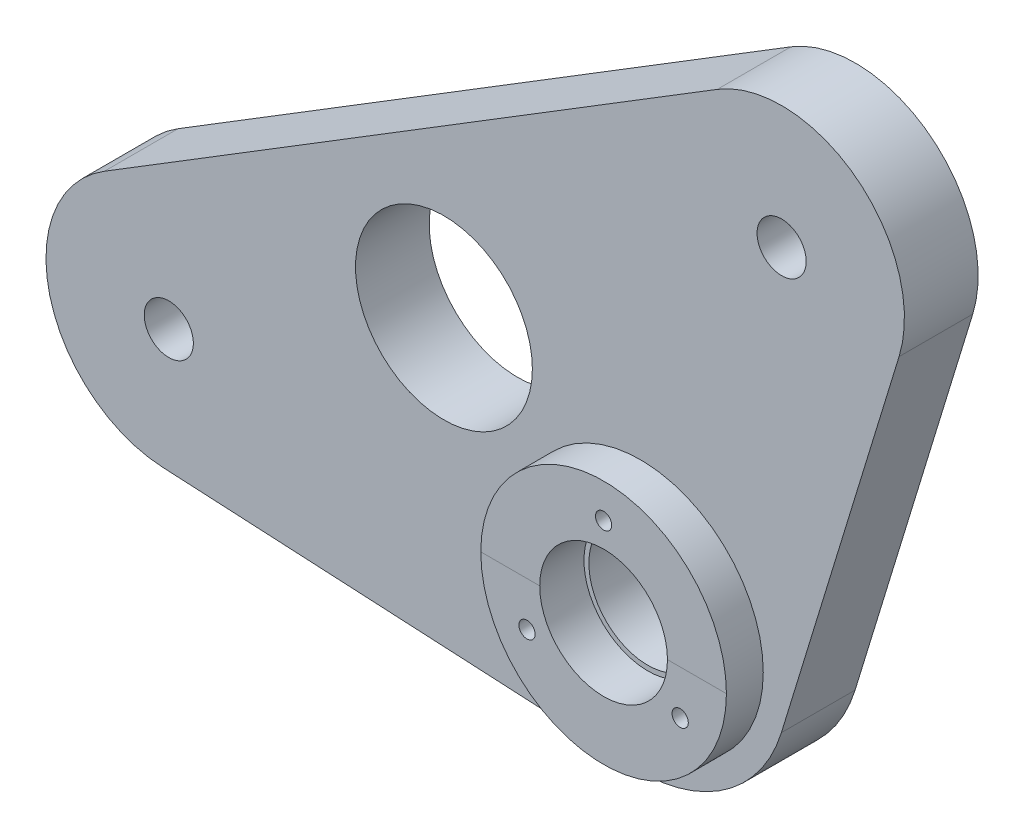
ISO-10303-21;
HEADER;
FILE_DESCRIPTION(('STEP AP214'),'2;1');
FILE_NAME('part.step','',(''),(''),'','','');
FILE_SCHEMA(('AUTOMOTIVE_DESIGN { 1 0 10303 214 1 1 1 1 }'));
ENDSEC;
DATA;
#1=APPLICATION_CONTEXT('core data for automotive mechanical design processes');
#2=APPLICATION_PROTOCOL_DEFINITION('international standard','automotive_design',2000,#1);
#3=PRODUCT_CONTEXT('',#1,'mechanical');
#4=PRODUCT('Part','Part','',(#3));
#5=PRODUCT_RELATED_PRODUCT_CATEGORY('part','',(#4));
#6=PRODUCT_DEFINITION_FORMATION('','',#4);
#7=PRODUCT_DEFINITION_CONTEXT('part definition',#1,'design');
#8=PRODUCT_DEFINITION('design','',#6,#7);
#9=PRODUCT_DEFINITION_SHAPE('','',#8);
#10=(LENGTH_UNIT() NAMED_UNIT(*) SI_UNIT(.MILLI.,.METRE.));
#11=(NAMED_UNIT(*) PLANE_ANGLE_UNIT() SI_UNIT($,.RADIAN.));
#12=(NAMED_UNIT(*) SI_UNIT($,.STERADIAN.) SOLID_ANGLE_UNIT());
#13=UNCERTAINTY_MEASURE_WITH_UNIT(LENGTH_MEASURE(1.E-05),#10,'distance_accuracy_value','');
#14=(GEOMETRIC_REPRESENTATION_CONTEXT(3) GLOBAL_UNCERTAINTY_ASSIGNED_CONTEXT((#13)) GLOBAL_UNIT_ASSIGNED_CONTEXT((#10,
#11,#12)) REPRESENTATION_CONTEXT('',''));
#15=CARTESIAN_POINT('',(0.,0.,0.));
#16=DIRECTION('',(0.,0.,1.));
#17=DIRECTION('',(1.,0.,0.));
#18=AXIS2_PLACEMENT_3D('',#15,#16,#17);
#19=CARTESIAN_POINT('',(0.,0.,15.));
#20=DIRECTION('',(0.,0.,1.));
#21=DIRECTION('',(1.,0.,0.));
#22=AXIS2_PLACEMENT_3D('',#19,#20,#21);
#23=PLANE('',#22);
#24=CARTESIAN_POINT('',(-15.5884572681198,-9.00000000000008,15.));
#25=DIRECTION('',(0.,0.,1.));
#26=DIRECTION('',(1.,0.,0.));
#27=AXIS2_PLACEMENT_3D('',#24,#25,#26);
#28=CIRCLE('',#27,1.64999999999999);
#29=CARTESIAN_POINT('',(-13.9384572681199,-9.00000000000008,15.));
#30=VERTEX_POINT('',#29);
#31=EDGE_CURVE('E168',#30,#30,#28,.T.);
#32=ORIENTED_EDGE('',*,*,#31,.F.);
#33=EDGE_LOOP('',(#32));
#34=FACE_BOUND('',#33,.T.);
#35=CARTESIAN_POINT('',(15.5884572681199,-9.00000000000007,15.));
#36=DIRECTION('',(0.,0.,1.));
#37=DIRECTION('',(1.,0.,0.));
#38=AXIS2_PLACEMENT_3D('',#35,#36,#37);
#39=CIRCLE('',#38,1.64999999999999);
#40=CARTESIAN_POINT('',(17.2384572681198,-9.00000000000007,15.));
#41=VERTEX_POINT('',#40);
#42=EDGE_CURVE('E162',#41,#41,#39,.T.);
#43=ORIENTED_EDGE('',*,*,#42,.F.);
#44=EDGE_LOOP('',(#43));
#45=FACE_BOUND('',#44,.T.);
#46=CARTESIAN_POINT('',(0.,0.,15.));
#47=DIRECTION('',(0.,0.,1.));
#48=DIRECTION('',(1.,0.,0.));
#49=AXIS2_PLACEMENT_3D('',#46,#47,#48);
#50=CIRCLE('',#49,13.);
#51=CARTESIAN_POINT('',(-13.,0.,15.));
#52=VERTEX_POINT('',#51);
#53=CARTESIAN_POINT('',(13.,0.,15.));
#54=VERTEX_POINT('',#53);
#55=EDGE_CURVE('E188',#52,#54,#50,.T.);
#56=ORIENTED_EDGE('',*,*,#55,.F.);
#57=DIRECTION('',(-1.,0.,0.));
#58=VECTOR('',#57,1.);
#59=CARTESIAN_POINT('',(0.,0.,15.));
#60=LINE('',#59,#58);
#61=CARTESIAN_POINT('',(-25.,0.,15.));
#62=VERTEX_POINT('',#61);
#63=EDGE_CURVE('E12',#52,#62,#60,.T.);
#64=ORIENTED_EDGE('',*,*,#63,.T.);
#65=CARTESIAN_POINT('',(0.,0.,15.));
#66=DIRECTION('',(0.,0.,1.));
#67=DIRECTION('',(1.,0.,0.));
#68=AXIS2_PLACEMENT_3D('',#65,#66,#67);
#69=CIRCLE('',#68,25.);
#70=CARTESIAN_POINT('',(25.,0.,15.));
#71=VERTEX_POINT('',#70);
#72=EDGE_CURVE('E192',#62,#71,#69,.T.);
#73=ORIENTED_EDGE('',*,*,#72,.T.);
#74=DIRECTION('',(-1.,0.,0.));
#75=VECTOR('',#74,1.);
#76=CARTESIAN_POINT('',(0.,0.,15.));
#77=LINE('',#76,#75);
#78=EDGE_CURVE('E57',#71,#54,#77,.T.);
#79=ORIENTED_EDGE('',*,*,#78,.T.);
#80=EDGE_LOOP('',(#56,#64,#73,#79));
#81=FACE_BOUND('',#80,.T.);
#82=ADVANCED_FACE('F48',(#34,#45,#81),#23,.T.);
#83=CARTESIAN_POINT('',(0.,0.,-15.));
#84=DIRECTION('',(0.,0.,1.));
#85=DIRECTION('',(1.,0.,0.));
#86=AXIS2_PLACEMENT_3D('',#83,#84,#85);
#87=CYLINDRICAL_SURFACE('',#86,12.);
#88=CARTESIAN_POINT('',(0.,0.,6.));
#89=DIRECTION('',(0.,0.,1.));
#90=DIRECTION('',(1.,0.,0.));
#91=AXIS2_PLACEMENT_3D('',#88,#89,#90);
#92=CIRCLE('',#91,12.);
#93=CARTESIAN_POINT('',(12.,0.,6.));
#94=VERTEX_POINT('',#93);
#95=EDGE_CURVE('E184',#94,#94,#92,.F.);
#96=ORIENTED_EDGE('',*,*,#95,.F.);
#97=EDGE_LOOP('',(#96));
#98=FACE_BOUND('',#97,.T.);
#99=CARTESIAN_POINT('',(0.,0.,-6.));
#100=DIRECTION('',(0.,0.,-1.));
#101=DIRECTION('',(-1.,0.,0.));
#102=AXIS2_PLACEMENT_3D('',#99,#100,#101);
#103=CIRCLE('',#102,12.);
#104=CARTESIAN_POINT('',(-12.,0.,-6.));
#105=VERTEX_POINT('',#104);
#106=EDGE_CURVE('E178',#105,#105,#103,.F.);
#107=ORIENTED_EDGE('',*,*,#106,.F.);
#108=EDGE_LOOP('',(#107));
#109=FACE_BOUND('',#108,.T.);
#110=ADVANCED_FACE('F285',(#98,#109),#87,.F.);
#111=CARTESIAN_POINT('',(-96.,0.,7.5));
#112=DIRECTION('',(0.,0.,-1.));
#113=DIRECTION('',(-1.,0.,0.));
#114=AXIS2_PLACEMENT_3D('',#111,#112,#113);
#115=CYLINDRICAL_SURFACE('',#114,25.);
#116=CARTESIAN_POINT('',(-96.,0.,-7.5));
#117=DIRECTION('',(0.,0.,1.));
#118=DIRECTION('',(1.,0.,0.));
#119=AXIS2_PLACEMENT_3D('',#116,#117,#118);
#120=CIRCLE('',#119,25.);
#121=CARTESIAN_POINT('',(-109.107307638029,21.2884589973548,-7.5));
#122=VERTEX_POINT('',#121);
#123=CARTESIAN_POINT('',(-97.3020833333333,-24.9660685529992,-7.5));
#124=VERTEX_POINT('',#123);
#125=EDGE_CURVE('E202',#122,#124,#120,.T.);
#126=ORIENTED_EDGE('',*,*,#125,.T.);
#127=DIRECTION('',(0.,0.,-1.));
#128=VECTOR('',#127,1.);
#129=CARTESIAN_POINT('',(-97.3020833333333,-24.9660685529992,7.5));
#130=LINE('',#129,#128);
#131=CARTESIAN_POINT('',(-97.3020833333333,-24.9660685529992,7.5));
#132=VERTEX_POINT('',#131);
#133=EDGE_CURVE('E251',#132,#124,#130,.T.);
#134=ORIENTED_EDGE('',*,*,#133,.F.);
#135=CARTESIAN_POINT('',(-96.,0.,7.5));
#136=DIRECTION('',(0.,0.,1.));
#137=DIRECTION('',(1.,0.,0.));
#138=AXIS2_PLACEMENT_3D('',#135,#136,#137);
#139=CIRCLE('',#138,25.);
#140=CARTESIAN_POINT('',(-109.107307638029,21.2884589973548,7.5));
#141=VERTEX_POINT('',#140);
#142=EDGE_CURVE('E211',#141,#132,#139,.T.);
#143=ORIENTED_EDGE('',*,*,#142,.F.);
#144=DIRECTION('',(0.,0.,-1.));
#145=VECTOR('',#144,1.);
#146=CARTESIAN_POINT('',(-109.107307638029,21.2884589973548,7.5));
#147=LINE('',#146,#145);
#148=EDGE_CURVE('E225',#141,#122,#147,.T.);
#149=ORIENTED_EDGE('',*,*,#148,.T.);
#150=EDGE_LOOP('',(#126,#134,#143,#149));
#151=FACE_BOUND('',#150,.T.);
#152=ADVANCED_FACE('F50',(#151),#115,.T.);
#153=CARTESIAN_POINT('',(-97.3020833333333,-24.9660685529992,7.5));
#154=DIRECTION('',(0.0520833333333332,0.998642742119968,0.));
#155=DIRECTION('',(-0.998642742119968,0.0520833333333332,0.));
#156=AXIS2_PLACEMENT_3D('',#153,#154,#155);
#157=PLANE('',#156);
#158=DIRECTION('',(0.998642742119968,-0.0520833333333332,0.));
#159=VECTOR('',#158,1.);
#160=CARTESIAN_POINT('',(-97.3020833333333,-24.9660685529992,-7.5));
#161=LINE('',#160,#159);
#162=CARTESIAN_POINT('',(-1.5625,-29.959282263599,-7.5));
#163=VERTEX_POINT('',#162);
#164=EDGE_CURVE('E228',#124,#163,#161,.T.);
#165=ORIENTED_EDGE('',*,*,#164,.T.);
#166=DIRECTION('',(0.,0.,-1.));
#167=VECTOR('',#166,1.);
#168=CARTESIAN_POINT('',(-1.5625,-29.959282263599,7.5));
#169=LINE('',#168,#167);
#170=CARTESIAN_POINT('',(-1.5625,-29.959282263599,7.5));
#171=VERTEX_POINT('',#170);
#172=EDGE_CURVE('E248',#171,#163,#169,.T.);
#173=ORIENTED_EDGE('',*,*,#172,.F.);
#174=DIRECTION('',(0.998642742119968,-0.0520833333333332,0.));
#175=VECTOR('',#174,1.);
#176=CARTESIAN_POINT('',(-97.3020833333333,-24.9660685529992,7.5));
#177=LINE('',#176,#175);
#178=EDGE_CURVE('E214',#132,#171,#177,.T.);
#179=ORIENTED_EDGE('',*,*,#178,.F.);
#180=ORIENTED_EDGE('',*,*,#133,.T.);
#181=EDGE_LOOP('',(#165,#173,#179,#180));
#182=FACE_BOUND('',#181,.T.);
#183=ADVANCED_FACE('F341',(#182),#157,.F.);
#184=CARTESIAN_POINT('',(0.,0.,7.5));
#185=DIRECTION('',(0.,0.,-1.));
#186=DIRECTION('',(-1.,0.,0.));
#187=AXIS2_PLACEMENT_3D('',#184,#185,#186);
#188=CYLINDRICAL_SURFACE('',#187,30.);
#189=CARTESIAN_POINT('',(0.,0.,-7.5));
#190=DIRECTION('',(0.,0.,1.));
#191=DIRECTION('',(1.,0.,0.));
#192=AXIS2_PLACEMENT_3D('',#189,#190,#191);
#193=CIRCLE('',#192,30.);
#194=CARTESIAN_POINT('',(28.6863265068597,-8.78035714204369,-7.5));
#195=VERTEX_POINT('',#194);
#196=EDGE_CURVE('E230',#163,#195,#193,.T.);
#197=ORIENTED_EDGE('',*,*,#196,.T.);
#198=DIRECTION('',(0.,0.,-1.));
#199=VECTOR('',#198,1.);
#200=CARTESIAN_POINT('',(28.6863265068597,-8.78035714204369,7.5));
#201=LINE('',#200,#199);
#202=CARTESIAN_POINT('',(28.6863265068597,-8.78035714204369,7.5));
#203=VERTEX_POINT('',#202);
#204=EDGE_CURVE('E245',#203,#195,#201,.T.);
#205=ORIENTED_EDGE('',*,*,#204,.F.);
#206=CARTESIAN_POINT('',(0.,0.,7.5));
#207=DIRECTION('',(0.,0.,1.));
#208=DIRECTION('',(1.,0.,0.));
#209=AXIS2_PLACEMENT_3D('',#206,#207,#208);
#210=CIRCLE('',#209,30.);
#211=EDGE_CURVE('E217',#171,#203,#210,.T.);
#212=ORIENTED_EDGE('',*,*,#211,.F.);
#213=ORIENTED_EDGE('',*,*,#172,.T.);
#214=EDGE_LOOP('',(#197,#205,#212,#213));
#215=FACE_BOUND('',#214,.T.);
#216=ADVANCED_FACE('F338',(#215),#188,.T.);
#217=CARTESIAN_POINT('',(28.6863265068597,-8.78035714204369,7.5));
#218=DIRECTION('',(-0.956210883561991,0.292678571401456,0.));
#219=DIRECTION('',(-0.292678571401456,-0.956210883561991,0.));
#220=AXIS2_PLACEMENT_3D('',#217,#218,#219);
#221=PLANE('',#220);
#222=DIRECTION('',(0.292678571401456,0.956210883561991,0.));
#223=VECTOR('',#222,1.);
#224=CARTESIAN_POINT('',(28.6863265068597,-8.78035714204369,-7.5));
#225=LINE('',#224,#223);
#226=CARTESIAN_POINT('',(52.6413121781087,69.4830357149636,-7.5));
#227=VERTEX_POINT('',#226);
#228=EDGE_CURVE('E232',#195,#227,#225,.T.);
#229=ORIENTED_EDGE('',*,*,#228,.T.);
#230=DIRECTION('',(0.,0.,-1.));
#231=VECTOR('',#230,1.);
#232=CARTESIAN_POINT('',(52.6413121781087,69.4830357149636,7.5));
#233=LINE('',#232,#231);
#234=CARTESIAN_POINT('',(52.6413121781087,69.4830357149636,7.5));
#235=VERTEX_POINT('',#234);
#236=EDGE_CURVE('E242',#235,#227,#233,.T.);
#237=ORIENTED_EDGE('',*,*,#236,.F.);
#238=DIRECTION('',(0.292678571401456,0.956210883561991,0.));
#239=VECTOR('',#238,1.);
#240=CARTESIAN_POINT('',(28.6863265068597,-8.78035714204369,7.5));
#241=LINE('',#240,#239);
#242=EDGE_CURVE('E219',#203,#235,#241,.T.);
#243=ORIENTED_EDGE('',*,*,#242,.F.);
#244=ORIENTED_EDGE('',*,*,#204,.T.);
#245=EDGE_LOOP('',(#229,#237,#243,#244));
#246=FACE_BOUND('',#245,.T.);
#247=ADVANCED_FACE('F334',(#246),#221,.F.);
#248=CARTESIAN_POINT('',(28.7360400890589,76.8,7.5));
#249=DIRECTION('',(0.,0.,-1.));
#250=DIRECTION('',(-1.,0.,0.));
#251=AXIS2_PLACEMENT_3D('',#248,#249,#250);
#252=CYLINDRICAL_SURFACE('',#251,25.);
#253=CARTESIAN_POINT('',(28.7360400890589,76.8,-7.5));
#254=DIRECTION('',(0.,0.,1.));
#255=DIRECTION('',(1.,0.,0.));
#256=AXIS2_PLACEMENT_3D('',#253,#254,#255);
#257=CIRCLE('',#256,25.);
#258=CARTESIAN_POINT('',(15.6287324510297,98.0884589973549,-7.5));
#259=VERTEX_POINT('',#258);
#260=EDGE_CURVE('E234',#227,#259,#257,.T.);
#261=ORIENTED_EDGE('',*,*,#260,.T.);
#262=DIRECTION('',(0.,0.,-1.));
#263=VECTOR('',#262,1.);
#264=CARTESIAN_POINT('',(15.6287324510297,98.0884589973549,7.5));
#265=LINE('',#264,#263);
#266=CARTESIAN_POINT('',(15.6287324510297,98.0884589973549,7.5));
#267=VERTEX_POINT('',#266);
#268=EDGE_CURVE('E239',#267,#259,#265,.T.);
#269=ORIENTED_EDGE('',*,*,#268,.F.);
#270=CARTESIAN_POINT('',(28.7360400890589,76.8,7.5));
#271=DIRECTION('',(0.,0.,1.));
#272=DIRECTION('',(1.,0.,0.));
#273=AXIS2_PLACEMENT_3D('',#270,#271,#272);
#274=CIRCLE('',#273,25.);
#275=EDGE_CURVE('E221',#235,#267,#274,.T.);
#276=ORIENTED_EDGE('',*,*,#275,.F.);
#277=ORIENTED_EDGE('',*,*,#236,.T.);
#278=EDGE_LOOP('',(#261,#269,#276,#277));
#279=FACE_BOUND('',#278,.T.);
#280=ADVANCED_FACE('F330',(#279),#252,.T.);
#281=CARTESIAN_POINT('',(-109.107307638029,21.2884589973548,7.5));
#282=DIRECTION('',(0.524292305521172,-0.851538359894194,0.));
#283=DIRECTION('',(0.851538359894194,0.524292305521172,0.));
#284=AXIS2_PLACEMENT_3D('',#281,#282,#283);
#285=PLANE('',#284);
#286=DIRECTION('',(-0.851538359894194,-0.524292305521172,0.));
#287=VECTOR('',#286,1.);
#288=CARTESIAN_POINT('',(-109.107307638029,21.2884589973548,-7.5));
#289=LINE('',#288,#287);
#290=EDGE_CURVE('E215',#259,#122,#289,.T.);
#291=ORIENTED_EDGE('',*,*,#290,.T.);
#292=ORIENTED_EDGE('',*,*,#148,.F.);
#293=DIRECTION('',(-0.851538359894194,-0.524292305521172,0.));
#294=VECTOR('',#293,1.);
#295=CARTESIAN_POINT('',(-109.107307638029,21.2884589973548,7.5));
#296=LINE('',#295,#294);
#297=EDGE_CURVE('E223',#267,#141,#296,.T.);
#298=ORIENTED_EDGE('',*,*,#297,.F.);
#299=ORIENTED_EDGE('',*,*,#268,.T.);
#300=EDGE_LOOP('',(#291,#292,#298,#299));
#301=FACE_BOUND('',#300,.T.);
#302=ADVANCED_FACE('F323',(#301),#285,.F.);
#303=CARTESIAN_POINT('',(-96.,0.,7.5));
#304=DIRECTION('',(0.,0.,1.));
#305=DIRECTION('',(1.,0.,0.));
#306=AXIS2_PLACEMENT_3D('',#303,#304,#305);
#307=PLANE('',#306);
#308=CARTESIAN_POINT('',(-40.,30.,7.5));
#309=DIRECTION('',(0.,0.,1.));
#310=DIRECTION('',(1.,0.,0.));
#311=AXIS2_PLACEMENT_3D('',#308,#309,#310);
#312=CIRCLE('',#311,18.);
#313=CARTESIAN_POINT('',(-22.,30.,7.5));
#314=VERTEX_POINT('',#313);
#315=EDGE_CURVE('E144',#314,#314,#312,.T.);
#316=ORIENTED_EDGE('',*,*,#315,.F.);
#317=EDGE_LOOP('',(#316));
#318=FACE_BOUND('',#317,.T.);
#319=CARTESIAN_POINT('',(0.,0.,7.5));
#320=DIRECTION('',(0.,0.,1.));
#321=DIRECTION('',(1.,0.,0.));
#322=AXIS2_PLACEMENT_3D('',#319,#320,#321);
#323=CIRCLE('',#322,25.);
#324=CARTESIAN_POINT('',(25.,0.,7.5));
#325=VERTEX_POINT('',#324);
#326=EDGE_CURVE('E191',#325,#325,#323,.F.);
#327=ORIENTED_EDGE('',*,*,#326,.T.);
#328=EDGE_LOOP('',(#327));
#329=FACE_BOUND('',#328,.T.);
#330=CARTESIAN_POINT('',(-96.,0.,7.5));
#331=DIRECTION('',(0.,0.,1.));
#332=DIRECTION('',(1.,0.,0.));
#333=AXIS2_PLACEMENT_3D('',#330,#331,#332);
#334=CIRCLE('',#333,5.);
#335=CARTESIAN_POINT('',(-91.,0.,7.5));
#336=VERTEX_POINT('',#335);
#337=EDGE_CURVE('E203',#336,#336,#334,.T.);
#338=ORIENTED_EDGE('',*,*,#337,.F.);
#339=EDGE_LOOP('',(#338));
#340=FACE_BOUND('',#339,.T.);
#341=CARTESIAN_POINT('',(28.7360400890589,76.8,7.5));
#342=DIRECTION('',(0.,0.,1.));
#343=DIRECTION('',(1.,0.,0.));
#344=AXIS2_PLACEMENT_3D('',#341,#342,#343);
#345=CIRCLE('',#344,5.);
#346=CARTESIAN_POINT('',(33.7360400890589,76.8,7.5));
#347=VERTEX_POINT('',#346);
#348=EDGE_CURVE('E206',#347,#347,#345,.T.);
#349=ORIENTED_EDGE('',*,*,#348,.F.);
#350=EDGE_LOOP('',(#349));
#351=FACE_BOUND('',#350,.T.);
#352=ORIENTED_EDGE('',*,*,#142,.T.);
#353=ORIENTED_EDGE('',*,*,#178,.T.);
#354=ORIENTED_EDGE('',*,*,#211,.T.);
#355=ORIENTED_EDGE('',*,*,#242,.T.);
#356=ORIENTED_EDGE('',*,*,#275,.T.);
#357=ORIENTED_EDGE('',*,*,#297,.T.);
#358=EDGE_LOOP('',(#352,#353,#354,#355,#356,#357));
#359=FACE_BOUND('',#358,.T.);
#360=ADVANCED_FACE('F320',(#318,#329,#340,#351,#359),#307,.T.);
#361=CARTESIAN_POINT('',(-96.,0.,-7.5));
#362=DIRECTION('',(0.,0.,1.));
#363=DIRECTION('',(1.,0.,0.));
#364=AXIS2_PLACEMENT_3D('',#361,#362,#363);
#365=PLANE('',#364);
#366=CARTESIAN_POINT('',(-40.,30.,-7.5));
#367=DIRECTION('',(0.,0.,1.));
#368=DIRECTION('',(1.,0.,0.));
#369=AXIS2_PLACEMENT_3D('',#366,#367,#368);
#370=CIRCLE('',#369,18.);
#371=CARTESIAN_POINT('',(-22.,30.,-7.5));
#372=VERTEX_POINT('',#371);
#373=EDGE_CURVE('E52',#372,#372,#370,.T.);
#374=ORIENTED_EDGE('',*,*,#373,.T.);
#375=EDGE_LOOP('',(#374));
#376=FACE_BOUND('',#375,.T.);
#377=CARTESIAN_POINT('',(0.,0.,-7.5));
#378=DIRECTION('',(0.,0.,1.));
#379=DIRECTION('',(1.,0.,0.));
#380=AXIS2_PLACEMENT_3D('',#377,#378,#379);
#381=CIRCLE('',#380,25.);
#382=CARTESIAN_POINT('',(25.,0.,-7.5));
#383=VERTEX_POINT('',#382);
#384=EDGE_CURVE('E254',#383,#383,#381,.F.);
#385=ORIENTED_EDGE('',*,*,#384,.F.);
#386=EDGE_LOOP('',(#385));
#387=FACE_BOUND('',#386,.T.);
#388=CARTESIAN_POINT('',(-96.,0.,-7.5));
#389=DIRECTION('',(0.,0.,1.));
#390=DIRECTION('',(1.,0.,0.));
#391=AXIS2_PLACEMENT_3D('',#388,#389,#390);
#392=CIRCLE('',#391,5.);
#393=CARTESIAN_POINT('',(-91.,0.,-7.5));
#394=VERTEX_POINT('',#393);
#395=EDGE_CURVE('E199',#394,#394,#392,.T.);
#396=ORIENTED_EDGE('',*,*,#395,.T.);
#397=EDGE_LOOP('',(#396));
#398=FACE_BOUND('',#397,.T.);
#399=CARTESIAN_POINT('',(28.7360400890589,76.8,-7.5));
#400=DIRECTION('',(0.,0.,1.));
#401=DIRECTION('',(1.,0.,0.));
#402=AXIS2_PLACEMENT_3D('',#399,#400,#401);
#403=CIRCLE('',#402,5.);
#404=CARTESIAN_POINT('',(33.7360400890589,76.8,-7.5));
#405=VERTEX_POINT('',#404);
#406=EDGE_CURVE('E198',#405,#405,#403,.T.);
#407=ORIENTED_EDGE('',*,*,#406,.T.);
#408=EDGE_LOOP('',(#407));
#409=FACE_BOUND('',#408,.T.);
#410=ORIENTED_EDGE('',*,*,#125,.F.);
#411=ORIENTED_EDGE('',*,*,#290,.F.);
#412=ORIENTED_EDGE('',*,*,#260,.F.);
#413=ORIENTED_EDGE('',*,*,#228,.F.);
#414=ORIENTED_EDGE('',*,*,#196,.F.);
#415=ORIENTED_EDGE('',*,*,#164,.F.);
#416=EDGE_LOOP('',(#410,#411,#412,#413,#414,#415));
#417=FACE_BOUND('',#416,.T.);
#418=ADVANCED_FACE('F318',(#376,#387,#398,#409,#417),#365,.F.);
#419=CARTESIAN_POINT('',(28.7360400890589,76.8,-7.5));
#420=DIRECTION('',(0.,0.,1.));
#421=DIRECTION('',(1.,0.,0.));
#422=AXIS2_PLACEMENT_3D('',#419,#420,#421);
#423=CYLINDRICAL_SURFACE('',#422,5.);
#424=ORIENTED_EDGE('',*,*,#406,.F.);
#425=EDGE_LOOP('',(#424));
#426=FACE_BOUND('',#425,.T.);
#427=ORIENTED_EDGE('',*,*,#348,.T.);
#428=EDGE_LOOP('',(#427));
#429=FACE_BOUND('',#428,.T.);
#430=ADVANCED_FACE('F314',(#426,#429),#423,.F.);
#431=CARTESIAN_POINT('',(-96.,0.,-7.5));
#432=DIRECTION('',(0.,0.,1.));
#433=DIRECTION('',(1.,0.,0.));
#434=AXIS2_PLACEMENT_3D('',#431,#432,#433);
#435=CYLINDRICAL_SURFACE('',#434,5.);
#436=ORIENTED_EDGE('',*,*,#395,.F.);
#437=EDGE_LOOP('',(#436));
#438=FACE_BOUND('',#437,.T.);
#439=ORIENTED_EDGE('',*,*,#337,.T.);
#440=EDGE_LOOP('',(#439));
#441=FACE_BOUND('',#440,.T.);
#442=ADVANCED_FACE('F311',(#438,#441),#435,.F.);
#443=CARTESIAN_POINT('',(0.,0.,-15.));
#444=DIRECTION('',(0.,0.,1.));
#445=DIRECTION('',(1.,0.,0.));
#446=AXIS2_PLACEMENT_3D('',#443,#444,#445);
#447=PLANE('',#446);
#448=CARTESIAN_POINT('',(0.,18.,-15.));
#449=DIRECTION('',(0.,0.,-1.));
#450=DIRECTION('',(-1.,0.,0.));
#451=AXIS2_PLACEMENT_3D('',#448,#449,#450);
#452=CIRCLE('',#451,1.64999999999999);
#453=CARTESIAN_POINT('',(-1.64999999999999,18.,-15.));
#454=VERTEX_POINT('',#453);
#455=EDGE_CURVE('E138',#454,#454,#452,.T.);
#456=ORIENTED_EDGE('',*,*,#455,.F.);
#457=EDGE_LOOP('',(#456));
#458=FACE_BOUND('',#457,.T.);
#459=CARTESIAN_POINT('',(-15.5854674215915,-8.99827381130211,-15.));
#460=DIRECTION('',(0.,0.,-1.));
#461=DIRECTION('',(-1.,0.,0.));
#462=AXIS2_PLACEMENT_3D('',#459,#460,#461);
#463=CIRCLE('',#462,1.64999999999999);
#464=CARTESIAN_POINT('',(-17.2354674215915,-8.99827381130211,-15.));
#465=VERTEX_POINT('',#464);
#466=EDGE_CURVE('E137',#465,#465,#463,.T.);
#467=ORIENTED_EDGE('',*,*,#466,.F.);
#468=EDGE_LOOP('',(#467));
#469=FACE_BOUND('',#468,.T.);
#470=CARTESIAN_POINT('',(15.5884572681198,-9.00000000000008,-15.));
#471=DIRECTION('',(0.,0.,-1.));
#472=DIRECTION('',(-1.,0.,0.));
#473=AXIS2_PLACEMENT_3D('',#470,#471,#472);
#474=CIRCLE('',#473,1.64999999999999);
#475=CARTESIAN_POINT('',(13.9384572681199,-9.00000000000008,-15.));
#476=VERTEX_POINT('',#475);
#477=EDGE_CURVE('E150',#476,#476,#474,.T.);
#478=ORIENTED_EDGE('',*,*,#477,.F.);
#479=EDGE_LOOP('',(#478));
#480=FACE_BOUND('',#479,.T.);
#481=CARTESIAN_POINT('',(0.,0.,-15.));
#482=DIRECTION('',(0.,0.,-1.));
#483=DIRECTION('',(-1.,0.,0.));
#484=AXIS2_PLACEMENT_3D('',#481,#482,#483);
#485=CIRCLE('',#484,13.);
#486=CARTESIAN_POINT('',(-13.,0.,-15.));
#487=VERTEX_POINT('',#486);
#488=EDGE_CURVE('E174',#487,#487,#485,.T.);
#489=ORIENTED_EDGE('',*,*,#488,.F.);
#490=EDGE_LOOP('',(#489));
#491=FACE_BOUND('',#490,.T.);
#492=CARTESIAN_POINT('',(0.,0.,-15.));
#493=DIRECTION('',(0.,0.,1.));
#494=DIRECTION('',(1.,0.,0.));
#495=AXIS2_PLACEMENT_3D('',#492,#493,#494);
#496=CIRCLE('',#495,25.);
#497=CARTESIAN_POINT('',(25.,0.,-15.));
#498=VERTEX_POINT('',#497);
#499=EDGE_CURVE('E193',#498,#498,#496,.T.);
#500=ORIENTED_EDGE('',*,*,#499,.F.);
#501=EDGE_LOOP('',(#500));
#502=FACE_BOUND('',#501,.T.);
#503=ADVANCED_FACE('F306',(#458,#469,#480,#491,#502),#447,.F.);
#504=CARTESIAN_POINT('',(0.,0.,15.));
#505=DIRECTION('',(0.,0.,-1.));
#506=DIRECTION('',(-1.,0.,0.));
#507=AXIS2_PLACEMENT_3D('',#504,#505,#506);
#508=CYLINDRICAL_SURFACE('',#507,25.);
#509=ORIENTED_EDGE('',*,*,#499,.T.);
#510=EDGE_LOOP('',(#509));
#511=FACE_BOUND('',#510,.T.);
#512=ORIENTED_EDGE('',*,*,#384,.T.);
#513=EDGE_LOOP('',(#512));
#514=FACE_BOUND('',#513,.T.);
#515=ADVANCED_FACE('F300',(#511,#514),#508,.T.);
#516=ORIENTED_EDGE('',*,*,#326,.F.);
#517=EDGE_LOOP('',(#516));
#518=FACE_BOUND('',#517,.T.);
#519=EDGE_CURVE('E189',#71,#62,#69,.T.);
#520=ORIENTED_EDGE('',*,*,#519,.F.);
#521=ORIENTED_EDGE('',*,*,#72,.F.);
#522=EDGE_LOOP('',(#520,#521));
#523=FACE_BOUND('',#522,.T.);
#524=ADVANCED_FACE('F296',(#518,#523),#508,.T.);
#525=ORIENTED_EDGE('',*,*,#63,.F.);
#526=EDGE_CURVE('E185',#54,#52,#50,.T.);
#527=ORIENTED_EDGE('',*,*,#526,.F.);
#528=ORIENTED_EDGE('',*,*,#78,.F.);
#529=ORIENTED_EDGE('',*,*,#519,.T.);
#530=EDGE_LOOP('',(#525,#527,#528,#529));
#531=FACE_BOUND('',#530,.T.);
#532=CARTESIAN_POINT('',(0.,18.,15.));
#533=DIRECTION('',(0.,0.,1.));
#534=DIRECTION('',(1.,0.,0.));
#535=AXIS2_PLACEMENT_3D('',#532,#533,#534);
#536=CIRCLE('',#535,1.64999999999999);
#537=CARTESIAN_POINT('',(1.64999999999999,18.,15.));
#538=VERTEX_POINT('',#537);
#539=EDGE_CURVE('E156',#538,#538,#536,.T.);
#540=ORIENTED_EDGE('',*,*,#539,.F.);
#541=EDGE_LOOP('',(#540));
#542=FACE_BOUND('',#541,.T.);
#543=ADVANCED_FACE('F264',(#531,#542),#23,.T.);
#544=CARTESIAN_POINT('',(0.,0.,6.));
#545=DIRECTION('',(0.,0.,1.));
#546=DIRECTION('',(1.,0.,0.));
#547=AXIS2_PLACEMENT_3D('',#544,#545,#546);
#548=PLANE('',#547);
#549=CARTESIAN_POINT('',(0.,0.,6.));
#550=DIRECTION('',(0.,0.,1.));
#551=DIRECTION('',(1.,0.,0.));
#552=AXIS2_PLACEMENT_3D('',#549,#550,#551);
#553=CIRCLE('',#552,13.);
#554=CARTESIAN_POINT('',(13.,0.,6.));
#555=VERTEX_POINT('',#554);
#556=EDGE_CURVE('E181',#555,#555,#553,.T.);
#557=ORIENTED_EDGE('',*,*,#556,.T.);
#558=EDGE_LOOP('',(#557));
#559=FACE_BOUND('',#558,.T.);
#560=ORIENTED_EDGE('',*,*,#95,.T.);
#561=EDGE_LOOP('',(#560));
#562=FACE_BOUND('',#561,.T.);
#563=ADVANCED_FACE('F270',(#559,#562),#548,.T.);
#564=CARTESIAN_POINT('',(0.,0.,6.));
#565=DIRECTION('',(0.,0.,1.));
#566=DIRECTION('',(1.,0.,0.));
#567=AXIS2_PLACEMENT_3D('',#564,#565,#566);
#568=CYLINDRICAL_SURFACE('',#567,13.);
#569=ORIENTED_EDGE('',*,*,#556,.F.);
#570=EDGE_LOOP('',(#569));
#571=FACE_BOUND('',#570,.T.);
#572=ORIENTED_EDGE('',*,*,#526,.T.);
#573=ORIENTED_EDGE('',*,*,#55,.T.);
#574=EDGE_LOOP('',(#572,#573));
#575=FACE_BOUND('',#574,.T.);
#576=ADVANCED_FACE('F267',(#571,#575),#568,.F.);
#577=CARTESIAN_POINT('',(0.,0.,-6.));
#578=DIRECTION('',(0.,0.,-1.));
#579=DIRECTION('',(-1.,0.,0.));
#580=AXIS2_PLACEMENT_3D('',#577,#578,#579);
#581=PLANE('',#580);
#582=CARTESIAN_POINT('',(0.,0.,-6.));
#583=DIRECTION('',(0.,0.,-1.));
#584=DIRECTION('',(-1.,0.,0.));
#585=AXIS2_PLACEMENT_3D('',#582,#583,#584);
#586=CIRCLE('',#585,13.);
#587=CARTESIAN_POINT('',(-13.,0.,-6.));
#588=VERTEX_POINT('',#587);
#589=EDGE_CURVE('E175',#588,#588,#586,.T.);
#590=ORIENTED_EDGE('',*,*,#589,.T.);
#591=EDGE_LOOP('',(#590));
#592=FACE_BOUND('',#591,.T.);
#593=ORIENTED_EDGE('',*,*,#106,.T.);
#594=EDGE_LOOP('',(#593));
#595=FACE_BOUND('',#594,.T.);
#596=ADVANCED_FACE('F269',(#592,#595),#581,.T.);
#597=CARTESIAN_POINT('',(0.,0.,-6.));
#598=DIRECTION('',(0.,0.,-1.));
#599=DIRECTION('',(-1.,0.,0.));
#600=AXIS2_PLACEMENT_3D('',#597,#598,#599);
#601=CYLINDRICAL_SURFACE('',#600,13.);
#602=ORIENTED_EDGE('',*,*,#589,.F.);
#603=EDGE_LOOP('',(#602));
#604=FACE_BOUND('',#603,.T.);
#605=ORIENTED_EDGE('',*,*,#488,.T.);
#606=EDGE_LOOP('',(#605));
#607=FACE_BOUND('',#606,.T.);
#608=ADVANCED_FACE('F277',(#604,#607),#601,.F.);
#609=CARTESIAN_POINT('',(-15.5884572681198,-9.00000000000008,6.));
#610=DIRECTION('',(0.,0.,1.));
#611=DIRECTION('',(1.,0.,0.));
#612=AXIS2_PLACEMENT_3D('',#609,#610,#611);
#613=CONICAL_SURFACE('',#612,1.65,1.02974425867665);
#614=CARTESIAN_POINT('',(-15.5884572681199,-9.00000000000008,5.00857997860452));
#615=VERTEX_POINT('',#614);
#616=VERTEX_LOOP('',#615);
#617=FACE_BOUND('',#616,.T.);
#618=CARTESIAN_POINT('',(-15.5884572681198,-9.00000000000008,6.));
#619=DIRECTION('',(0.,0.,1.));
#620=DIRECTION('',(1.,0.,0.));
#621=AXIS2_PLACEMENT_3D('',#618,#619,#620);
#622=CIRCLE('',#621,1.65);
#623=CARTESIAN_POINT('',(-13.9384572681199,-9.00000000000008,6.));
#624=VERTEX_POINT('',#623);
#625=EDGE_CURVE('E171',#624,#624,#622,.T.);
#626=ORIENTED_EDGE('',*,*,#625,.T.);
#627=EDGE_LOOP('',(#626));
#628=FACE_BOUND('',#627,.T.);
#629=ADVANCED_FACE('F395',(#617,#628),#613,.F.);
#630=CARTESIAN_POINT('',(-15.5884572681198,-9.00000000000008,15.));
#631=DIRECTION('',(0.,0.,1.));
#632=DIRECTION('',(1.,0.,0.));
#633=AXIS2_PLACEMENT_3D('',#630,#631,#632);
#634=CYLINDRICAL_SURFACE('',#633,1.64999999999999);
#635=ORIENTED_EDGE('',*,*,#625,.F.);
#636=EDGE_LOOP('',(#635));
#637=FACE_BOUND('',#636,.T.);
#638=ORIENTED_EDGE('',*,*,#31,.T.);
#639=EDGE_LOOP('',(#638));
#640=FACE_BOUND('',#639,.T.);
#641=ADVANCED_FACE('F406',(#637,#640),#634,.F.);
#642=CARTESIAN_POINT('',(15.5884572681199,-9.00000000000007,6.));
#643=DIRECTION('',(0.,0.,1.));
#644=DIRECTION('',(1.,0.,0.));
#645=AXIS2_PLACEMENT_3D('',#642,#643,#644);
#646=CONICAL_SURFACE('',#645,1.65,1.02974425867665);
#647=CARTESIAN_POINT('',(15.5884572681199,-9.00000000000007,5.00857997860452));
#648=VERTEX_POINT('',#647);
#649=VERTEX_LOOP('',#648);
#650=FACE_BOUND('',#649,.T.);
#651=CARTESIAN_POINT('',(15.5884572681199,-9.00000000000007,6.));
#652=DIRECTION('',(0.,0.,1.));
#653=DIRECTION('',(1.,0.,0.));
#654=AXIS2_PLACEMENT_3D('',#651,#652,#653);
#655=CIRCLE('',#654,1.65);
#656=CARTESIAN_POINT('',(17.2384572681199,-9.00000000000007,6.));
#657=VERTEX_POINT('',#656);
#658=EDGE_CURVE('E165',#657,#657,#655,.T.);
#659=ORIENTED_EDGE('',*,*,#658,.T.);
#660=EDGE_LOOP('',(#659));
#661=FACE_BOUND('',#660,.T.);
#662=ADVANCED_FACE('F418',(#650,#661),#646,.F.);
#663=CARTESIAN_POINT('',(15.5884572681199,-9.00000000000007,15.));
#664=DIRECTION('',(0.,0.,1.));
#665=DIRECTION('',(1.,0.,0.));
#666=AXIS2_PLACEMENT_3D('',#663,#664,#665);
#667=CYLINDRICAL_SURFACE('',#666,1.64999999999999);
#668=ORIENTED_EDGE('',*,*,#658,.F.);
#669=EDGE_LOOP('',(#668));
#670=FACE_BOUND('',#669,.T.);
#671=ORIENTED_EDGE('',*,*,#42,.T.);
#672=EDGE_LOOP('',(#671));
#673=FACE_BOUND('',#672,.T.);
#674=ADVANCED_FACE('F432',(#670,#673),#667,.F.);
#675=CARTESIAN_POINT('',(0.,18.,6.));
#676=DIRECTION('',(0.,0.,1.));
#677=DIRECTION('',(1.,0.,0.));
#678=AXIS2_PLACEMENT_3D('',#675,#676,#677);
#679=CONICAL_SURFACE('',#678,1.65,1.02974425867665);
#680=CARTESIAN_POINT('',(0.,18.,5.00857997860452));
#681=VERTEX_POINT('',#680);
#682=VERTEX_LOOP('',#681);
#683=FACE_BOUND('',#682,.T.);
#684=CARTESIAN_POINT('',(0.,18.,6.));
#685=DIRECTION('',(0.,0.,1.));
#686=DIRECTION('',(1.,0.,0.));
#687=AXIS2_PLACEMENT_3D('',#684,#685,#686);
#688=CIRCLE('',#687,1.65);
#689=CARTESIAN_POINT('',(1.65,18.,6.));
#690=VERTEX_POINT('',#689);
#691=EDGE_CURVE('E159',#690,#690,#688,.T.);
#692=ORIENTED_EDGE('',*,*,#691,.T.);
#693=EDGE_LOOP('',(#692));
#694=FACE_BOUND('',#693,.T.);
#695=ADVANCED_FACE('F443',(#683,#694),#679,.F.);
#696=CARTESIAN_POINT('',(0.,18.,15.));
#697=DIRECTION('',(0.,0.,1.));
#698=DIRECTION('',(1.,0.,0.));
#699=AXIS2_PLACEMENT_3D('',#696,#697,#698);
#700=CYLINDRICAL_SURFACE('',#699,1.64999999999999);
#701=ORIENTED_EDGE('',*,*,#691,.F.);
#702=EDGE_LOOP('',(#701));
#703=FACE_BOUND('',#702,.T.);
#704=ORIENTED_EDGE('',*,*,#539,.T.);
#705=EDGE_LOOP('',(#704));
#706=FACE_BOUND('',#705,.T.);
#707=ADVANCED_FACE('F456',(#703,#706),#700,.F.);
#708=CARTESIAN_POINT('',(15.5884572681198,-9.00000000000008,-6.));
#709=DIRECTION('',(0.,0.,-1.));
#710=DIRECTION('',(-1.,0.,0.));
#711=AXIS2_PLACEMENT_3D('',#708,#709,#710);
#712=CONICAL_SURFACE('',#711,1.65,1.02974425867665);
#713=CARTESIAN_POINT('',(15.5884572681198,-9.00000000000008,-5.00857997860452));
#714=VERTEX_POINT('',#713);
#715=VERTEX_LOOP('',#714);
#716=FACE_BOUND('',#715,.T.);
#717=CARTESIAN_POINT('',(15.5884572681198,-9.00000000000008,-6.));
#718=DIRECTION('',(0.,0.,-1.));
#719=DIRECTION('',(-1.,0.,0.));
#720=AXIS2_PLACEMENT_3D('',#717,#718,#719);
#721=CIRCLE('',#720,1.65);
#722=CARTESIAN_POINT('',(13.9384572681199,-9.00000000000008,-6.));
#723=VERTEX_POINT('',#722);
#724=EDGE_CURVE('E153',#723,#723,#721,.T.);
#725=ORIENTED_EDGE('',*,*,#724,.T.);
#726=EDGE_LOOP('',(#725));
#727=FACE_BOUND('',#726,.T.);
#728=ADVANCED_FACE('F467',(#716,#727),#712,.F.);
#729=CARTESIAN_POINT('',(15.5884572681198,-9.00000000000008,-15.));
#730=DIRECTION('',(0.,0.,-1.));
#731=DIRECTION('',(-1.,0.,0.));
#732=AXIS2_PLACEMENT_3D('',#729,#730,#731);
#733=CYLINDRICAL_SURFACE('',#732,1.64999999999999);
#734=ORIENTED_EDGE('',*,*,#724,.F.);
#735=EDGE_LOOP('',(#734));
#736=FACE_BOUND('',#735,.T.);
#737=ORIENTED_EDGE('',*,*,#477,.T.);
#738=EDGE_LOOP('',(#737));
#739=FACE_BOUND('',#738,.T.);
#740=ADVANCED_FACE('F494',(#736,#739),#733,.F.);
#741=CARTESIAN_POINT('',(-15.5854674215915,-8.99827381130211,-6.));
#742=DIRECTION('',(0.,0.,-1.));
#743=DIRECTION('',(-1.,0.,0.));
#744=AXIS2_PLACEMENT_3D('',#741,#742,#743);
#745=CONICAL_SURFACE('',#744,1.65,1.02974425867665);
#746=CARTESIAN_POINT('',(-15.5854674215915,-8.99827381130211,-5.00857997860452));
#747=VERTEX_POINT('',#746);
#748=VERTEX_LOOP('',#747);
#749=FACE_BOUND('',#748,.T.);
#750=CARTESIAN_POINT('',(-15.5854674215915,-8.99827381130211,-6.));
#751=DIRECTION('',(0.,0.,-1.));
#752=DIRECTION('',(-1.,0.,0.));
#753=AXIS2_PLACEMENT_3D('',#750,#751,#752);
#754=CIRCLE('',#753,1.65);
#755=CARTESIAN_POINT('',(-17.2354674215915,-8.99827381130211,-6.));
#756=VERTEX_POINT('',#755);
#757=EDGE_CURVE('E141',#756,#756,#754,.T.);
#758=ORIENTED_EDGE('',*,*,#757,.T.);
#759=EDGE_LOOP('',(#758));
#760=FACE_BOUND('',#759,.T.);
#761=ADVANCED_FACE('F505',(#749,#760),#745,.F.);
#762=CARTESIAN_POINT('',(-15.5854674215915,-8.99827381130211,-15.));
#763=DIRECTION('',(0.,0.,-1.));
#764=DIRECTION('',(-1.,0.,0.));
#765=AXIS2_PLACEMENT_3D('',#762,#763,#764);
#766=CYLINDRICAL_SURFACE('',#765,1.64999999999999);
#767=ORIENTED_EDGE('',*,*,#757,.F.);
#768=EDGE_LOOP('',(#767));
#769=FACE_BOUND('',#768,.T.);
#770=ORIENTED_EDGE('',*,*,#466,.T.);
#771=EDGE_LOOP('',(#770));
#772=FACE_BOUND('',#771,.T.);
#773=ADVANCED_FACE('F131',(#769,#772),#766,.F.);
#774=CARTESIAN_POINT('',(0.,18.,-6.));
#775=DIRECTION('',(0.,0.,-1.));
#776=DIRECTION('',(-1.,0.,0.));
#777=AXIS2_PLACEMENT_3D('',#774,#775,#776);
#778=CONICAL_SURFACE('',#777,1.65,1.02974425867665);
#779=CARTESIAN_POINT('',(0.,18.,-5.00857997860452));
#780=VERTEX_POINT('',#779);
#781=VERTEX_LOOP('',#780);
#782=FACE_BOUND('',#781,.T.);
#783=CARTESIAN_POINT('',(0.,18.,-6.));
#784=DIRECTION('',(0.,0.,-1.));
#785=DIRECTION('',(-1.,0.,0.));
#786=AXIS2_PLACEMENT_3D('',#783,#784,#785);
#787=CIRCLE('',#786,1.65);
#788=CARTESIAN_POINT('',(-1.65,18.,-6.));
#789=VERTEX_POINT('',#788);
#790=EDGE_CURVE('E135',#789,#789,#787,.T.);
#791=ORIENTED_EDGE('',*,*,#790,.T.);
#792=EDGE_LOOP('',(#791));
#793=FACE_BOUND('',#792,.T.);
#794=ADVANCED_FACE('F127',(#782,#793),#778,.F.);
#795=CARTESIAN_POINT('',(0.,18.,-15.));
#796=DIRECTION('',(0.,0.,-1.));
#797=DIRECTION('',(-1.,0.,0.));
#798=AXIS2_PLACEMENT_3D('',#795,#796,#797);
#799=CYLINDRICAL_SURFACE('',#798,1.64999999999999);
#800=ORIENTED_EDGE('',*,*,#790,.F.);
#801=EDGE_LOOP('',(#800));
#802=FACE_BOUND('',#801,.T.);
#803=ORIENTED_EDGE('',*,*,#455,.T.);
#804=EDGE_LOOP('',(#803));
#805=FACE_BOUND('',#804,.T.);
#806=ADVANCED_FACE('F130',(#802,#805),#799,.F.);
#807=CARTESIAN_POINT('',(-40.,30.,-15.));
#808=DIRECTION('',(0.,0.,1.));
#809=DIRECTION('',(1.,0.,0.));
#810=AXIS2_PLACEMENT_3D('',#807,#808,#809);
#811=CYLINDRICAL_SURFACE('',#810,18.);
#812=CARTESIAN_POINT('',(-22.,30.,7.5));
#813=CARTESIAN_POINT('',(-22.,30.,7.34375));
#814=CARTESIAN_POINT('',(-22.,30.,7.1875));
#815=CARTESIAN_POINT('',(-22.,30.,6.875));
#816=CARTESIAN_POINT('',(-22.,30.,6.71875));
#817=CARTESIAN_POINT('',(-22.,30.,6.40625));
#818=CARTESIAN_POINT('',(-22.,30.,6.25));
#819=CARTESIAN_POINT('',(-22.,30.,5.93749999999999));
#820=CARTESIAN_POINT('',(-22.,30.,5.78124999999999));
#821=CARTESIAN_POINT('',(-22.,30.,5.46875));
#822=CARTESIAN_POINT('',(-22.,30.,5.3125));
#823=CARTESIAN_POINT('',(-22.,30.,5.));
#824=CARTESIAN_POINT('',(-22.,30.,4.84375));
#825=CARTESIAN_POINT('',(-22.,30.,4.53125));
#826=CARTESIAN_POINT('',(-22.,30.,4.375));
#827=CARTESIAN_POINT('',(-22.,30.,4.0625));
#828=CARTESIAN_POINT('',(-22.,30.,3.90625));
#829=CARTESIAN_POINT('',(-22.,30.,3.59375));
#830=CARTESIAN_POINT('',(-22.,30.,3.4375));
#831=CARTESIAN_POINT('',(-22.,30.,3.125));
#832=CARTESIAN_POINT('',(-22.,30.,2.96875));
#833=CARTESIAN_POINT('',(-22.,30.,2.65625));
#834=CARTESIAN_POINT('',(-22.,30.,2.5));
#835=CARTESIAN_POINT('',(-22.,30.,2.1875));
#836=CARTESIAN_POINT('',(-22.,30.,2.03125));
#837=CARTESIAN_POINT('',(-22.,30.,1.71875));
#838=CARTESIAN_POINT('',(-22.,30.,1.5625));
#839=CARTESIAN_POINT('',(-22.,30.,1.25));
#840=CARTESIAN_POINT('',(-22.,30.,1.09375));
#841=CARTESIAN_POINT('',(-22.,30.,0.781249999999998));
#842=CARTESIAN_POINT('',(-22.,30.,0.624999999999998));
#843=CARTESIAN_POINT('',(-22.,30.,0.312499999999999));
#844=CARTESIAN_POINT('',(-22.,30.,0.156249999999998));
#845=CARTESIAN_POINT('',(-22.,30.,-0.156250000000002));
#846=CARTESIAN_POINT('',(-22.,30.,-0.312500000000002));
#847=CARTESIAN_POINT('',(-22.,30.,-0.625000000000002));
#848=CARTESIAN_POINT('',(-22.,30.,-0.781250000000002));
#849=CARTESIAN_POINT('',(-22.,30.,-1.09375));
#850=CARTESIAN_POINT('',(-22.,30.,-1.25));
#851=CARTESIAN_POINT('',(-22.,30.,-1.5625));
#852=CARTESIAN_POINT('',(-22.,30.,-1.71875));
#853=CARTESIAN_POINT('',(-22.,30.,-2.03125));
#854=CARTESIAN_POINT('',(-22.,30.,-2.1875));
#855=CARTESIAN_POINT('',(-22.,30.,-2.5));
#856=CARTESIAN_POINT('',(-22.,30.,-2.65625));
#857=CARTESIAN_POINT('',(-22.,30.,-2.96875));
#858=CARTESIAN_POINT('',(-22.,30.,-3.125));
#859=CARTESIAN_POINT('',(-22.,30.,-3.4375));
#860=CARTESIAN_POINT('',(-22.,30.,-3.59375));
#861=CARTESIAN_POINT('',(-22.,30.,-3.90625));
#862=CARTESIAN_POINT('',(-22.,30.,-4.0625));
#863=CARTESIAN_POINT('',(-22.,30.,-4.375));
#864=CARTESIAN_POINT('',(-22.,30.,-4.53125));
#865=CARTESIAN_POINT('',(-22.,30.,-4.84375));
#866=CARTESIAN_POINT('',(-22.,30.,-5.));
#867=CARTESIAN_POINT('',(-22.,30.,-5.3125));
#868=CARTESIAN_POINT('',(-22.,30.,-5.46875));
#869=CARTESIAN_POINT('',(-22.,30.,-5.78125));
#870=CARTESIAN_POINT('',(-22.,30.,-5.9375));
#871=CARTESIAN_POINT('',(-22.,30.,-6.25));
#872=CARTESIAN_POINT('',(-22.,30.,-6.40625));
#873=CARTESIAN_POINT('',(-22.,30.,-6.71875));
#874=CARTESIAN_POINT('',(-22.,30.,-6.875));
#875=CARTESIAN_POINT('',(-22.,30.,-7.1875));
#876=CARTESIAN_POINT('',(-22.,30.,-7.34375));
#877=CARTESIAN_POINT('',(-22.,30.,-7.5));
#878=B_SPLINE_CURVE_WITH_KNOTS('',3,(#812,#813,#814,#815,#816,#817,#818,#819,#820,#821,#822,
#823,#824,#825,#826,#827,#828,#829,#830,#831,#832,#833,#834,#835,#836,#837,#838,#839,#840,#841,
#842,#843,#844,#845,#846,#847,#848,#849,#850,#851,#852,#853,#854,#855,#856,#857,#858,#859,#860,
#861,#862,#863,#864,#865,#866,#867,#868,#869,#870,#871,#872,#873,#874,#875,#876,#877),
.UNSPECIFIED.,.F.,.F.,(4,2,2,2,2,2,2,2,2,2,2,2,2,2,2,2,2,2,2,2,2,2,2,2,2,2,2,2,2,2,2,2,4),(0.,
0.46875,0.937500000000001,1.40625,1.875,2.34375,2.8125,3.28125,3.75,4.21875,4.6875,5.15625,
5.625,6.09375,6.5625,7.03125,7.5,7.96875,8.4375,8.90625,9.375,9.84375,10.3125,10.78125,11.25,
11.71875,12.1875,12.65625,13.125,13.59375,14.0625,14.53125,15.),.UNSPECIFIED.);
#879=EDGE_CURVE('BSEAM546',#314,#372,#878,.T.);
#880=ORIENTED_EDGE('',*,*,#315,.T.);
#881=ORIENTED_EDGE('',*,*,#373,.F.);
#882=ORIENTED_EDGE('',*,*,#879,.T.);
#883=ORIENTED_EDGE('',*,*,#879,.F.);
#884=EDGE_LOOP('',(#880,#882,#881,#883));
#885=FACE_BOUND('',#884,.T.);
#886=ADVANCED_FACE('F546',(#885),#811,.F.);
#887=CLOSED_SHELL('',(#82,#110,#152,#183,#216,#247,#280,#302,#360,#418,#430,#442,#503,#515,#524,
#543,#563,#576,#596,#608,#629,#641,#662,#674,#695,#707,#728,#740,#761,#773,#794,#806,#886));
#888=MANIFOLD_SOLID_BREP('B2',#887);
#889=ADVANCED_BREP_SHAPE_REPRESENTATION('',(#18,#888),#14);
#890=SHAPE_DEFINITION_REPRESENTATION(#9,#889);
ENDSEC;
END-ISO-10303-21;
